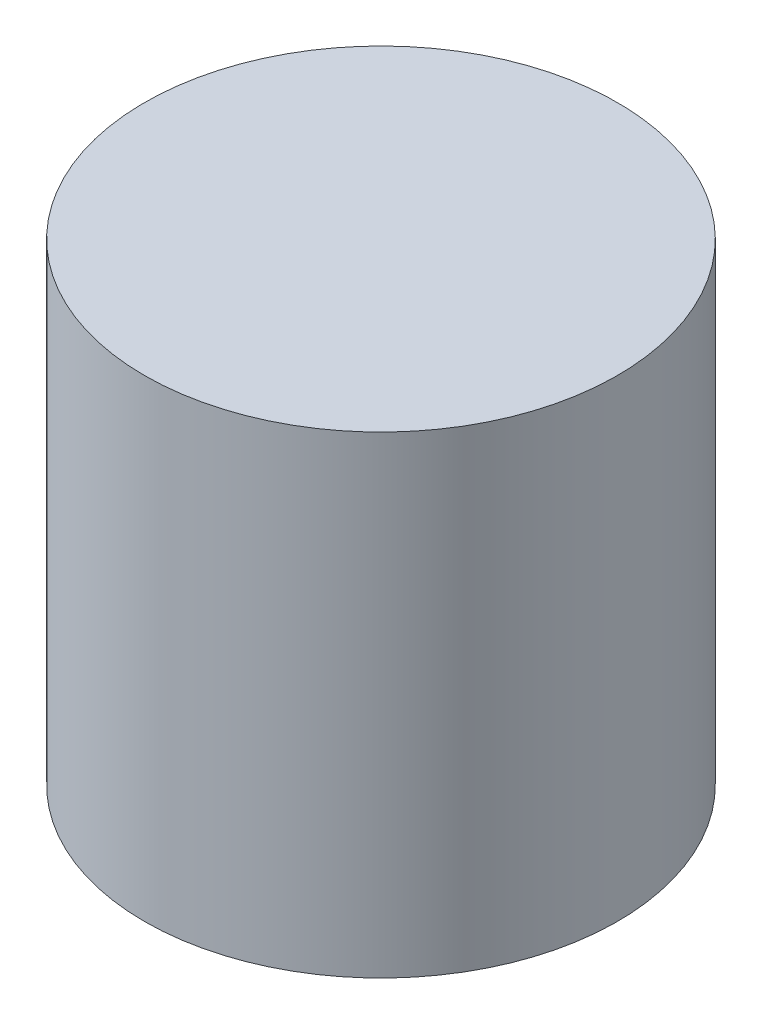
ISO-10303-21;
HEADER;
FILE_DESCRIPTION(('STEP AP214'),'2;1');
FILE_NAME('part.step','',(''),(''),'','','');
FILE_SCHEMA(('AUTOMOTIVE_DESIGN { 1 0 10303 214 1 1 1 1 }'));
ENDSEC;
DATA;
#1=APPLICATION_CONTEXT('core data for automotive mechanical design processes');
#2=APPLICATION_PROTOCOL_DEFINITION('international standard','automotive_design',2000,#1);
#3=PRODUCT_CONTEXT('',#1,'mechanical');
#4=PRODUCT('Part','Part','',(#3));
#5=PRODUCT_RELATED_PRODUCT_CATEGORY('part','',(#4));
#6=PRODUCT_DEFINITION_FORMATION('','',#4);
#7=PRODUCT_DEFINITION_CONTEXT('part definition',#1,'design');
#8=PRODUCT_DEFINITION('design','',#6,#7);
#9=PRODUCT_DEFINITION_SHAPE('','',#8);
#10=(LENGTH_UNIT() NAMED_UNIT(*) SI_UNIT(.MILLI.,.METRE.));
#11=(NAMED_UNIT(*) PLANE_ANGLE_UNIT() SI_UNIT($,.RADIAN.));
#12=(NAMED_UNIT(*) SI_UNIT($,.STERADIAN.) SOLID_ANGLE_UNIT());
#13=UNCERTAINTY_MEASURE_WITH_UNIT(LENGTH_MEASURE(1.E-05),#10,'distance_accuracy_value','');
#14=(GEOMETRIC_REPRESENTATION_CONTEXT(3) GLOBAL_UNCERTAINTY_ASSIGNED_CONTEXT((#13)) GLOBAL_UNIT_ASSIGNED_CONTEXT((#10,
#11,#12)) REPRESENTATION_CONTEXT('',''));
#15=CARTESIAN_POINT('',(0.,0.,0.));
#16=DIRECTION('',(0.,0.,1.));
#17=DIRECTION('',(1.,0.,0.));
#18=AXIS2_PLACEMENT_3D('',#15,#16,#17);
#19=CARTESIAN_POINT('',(0.,2.54,0.));
#20=DIRECTION('',(0.,-1.,0.));
#21=DIRECTION('',(0.,0.,-1.));
#22=AXIS2_PLACEMENT_3D('',#19,#20,#21);
#23=CYLINDRICAL_SURFACE('',#22,1.27);
#24=CARTESIAN_POINT('',(0.,2.54,0.));
#25=DIRECTION('',(0.,1.,0.));
#26=DIRECTION('',(0.,0.,1.));
#27=AXIS2_PLACEMENT_3D('',#24,#25,#26);
#28=CIRCLE('',#27,1.27);
#29=CARTESIAN_POINT('',(0.,2.54,1.27));
#30=VERTEX_POINT('',#29);
#31=EDGE_CURVE('E12',#30,#30,#28,.T.);
#32=ORIENTED_EDGE('',*,*,#31,.F.);
#33=EDGE_LOOP('',(#32));
#34=FACE_BOUND('',#33,.T.);
#35=CARTESIAN_POINT('',(0.,0.,0.));
#36=DIRECTION('',(0.,1.,0.));
#37=DIRECTION('',(0.,0.,1.));
#38=AXIS2_PLACEMENT_3D('',#35,#36,#37);
#39=CIRCLE('',#38,1.27);
#40=CARTESIAN_POINT('',(0.,0.,1.27));
#41=VERTEX_POINT('',#40);
#42=EDGE_CURVE('E48',#41,#41,#39,.T.);
#43=ORIENTED_EDGE('',*,*,#42,.T.);
#44=EDGE_LOOP('',(#43));
#45=FACE_BOUND('',#44,.T.);
#46=ADVANCED_FACE('F45',(#34,#45),#23,.T.);
#47=CARTESIAN_POINT('',(0.,2.54,0.));
#48=DIRECTION('',(0.,1.,0.));
#49=DIRECTION('',(0.,0.,1.));
#50=AXIS2_PLACEMENT_3D('',#47,#48,#49);
#51=PLANE('',#50);
#52=ORIENTED_EDGE('',*,*,#31,.T.);
#53=EDGE_LOOP('',(#52));
#54=FACE_BOUND('',#53,.T.);
#55=ADVANCED_FACE('F60',(#54),#51,.T.);
#56=CARTESIAN_POINT('',(0.,0.,0.));
#57=DIRECTION('',(0.,1.,0.));
#58=DIRECTION('',(0.,0.,1.));
#59=AXIS2_PLACEMENT_3D('',#56,#57,#58);
#60=PLANE('',#59);
#61=ORIENTED_EDGE('',*,*,#42,.F.);
#62=EDGE_LOOP('',(#61));
#63=FACE_BOUND('',#62,.T.);
#64=ADVANCED_FACE('F58',(#63),#60,.F.);
#65=CLOSED_SHELL('',(#46,#55,#64));
#66=MANIFOLD_SOLID_BREP('B2',#65);
#67=ADVANCED_BREP_SHAPE_REPRESENTATION('',(#18,#66),#14);
#68=SHAPE_DEFINITION_REPRESENTATION(#9,#67);
ENDSEC;
END-ISO-10303-21;
